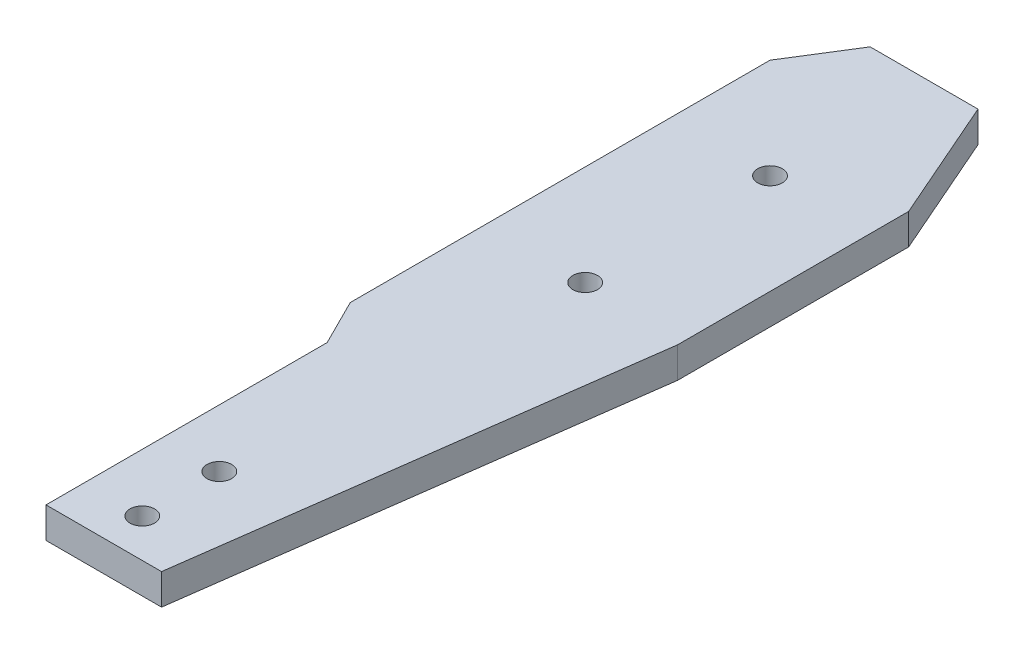
ISO-10303-21;
HEADER;
FILE_DESCRIPTION(('STEP AP214'),'2;1');
FILE_NAME('part.step','',(''),(''),'','','');
FILE_SCHEMA(('AUTOMOTIVE_DESIGN { 1 0 10303 214 1 1 1 1 }'));
ENDSEC;
DATA;
#1=APPLICATION_CONTEXT('core data for automotive mechanical design processes');
#2=APPLICATION_PROTOCOL_DEFINITION('international standard','automotive_design',2000,#1);
#3=PRODUCT_CONTEXT('',#1,'mechanical');
#4=PRODUCT('Part','Part','',(#3));
#5=PRODUCT_RELATED_PRODUCT_CATEGORY('part','',(#4));
#6=PRODUCT_DEFINITION_FORMATION('','',#4);
#7=PRODUCT_DEFINITION_CONTEXT('part definition',#1,'design');
#8=PRODUCT_DEFINITION('design','',#6,#7);
#9=PRODUCT_DEFINITION_SHAPE('','',#8);
#10=(LENGTH_UNIT() NAMED_UNIT(*) SI_UNIT(.MILLI.,.METRE.));
#11=(NAMED_UNIT(*) PLANE_ANGLE_UNIT() SI_UNIT($,.RADIAN.));
#12=(NAMED_UNIT(*) SI_UNIT($,.STERADIAN.) SOLID_ANGLE_UNIT());
#13=UNCERTAINTY_MEASURE_WITH_UNIT(LENGTH_MEASURE(1.E-05),#10,'distance_accuracy_value','');
#14=(GEOMETRIC_REPRESENTATION_CONTEXT(3) GLOBAL_UNCERTAINTY_ASSIGNED_CONTEXT((#13)) GLOBAL_UNIT_ASSIGNED_CONTEXT((#10,
#11,#12)) REPRESENTATION_CONTEXT('',''));
#15=CARTESIAN_POINT('',(0.,0.,0.));
#16=DIRECTION('',(0.,0.,1.));
#17=DIRECTION('',(1.,0.,0.));
#18=AXIS2_PLACEMENT_3D('',#15,#16,#17);
#19=CARTESIAN_POINT('',(0.,4.,0.));
#20=DIRECTION('',(1.,0.,0.));
#21=DIRECTION('',(0.,0.,-1.));
#22=AXIS2_PLACEMENT_3D('',#19,#20,#21);
#23=PLANE('',#22);
#24=DIRECTION('',(0.,0.,1.));
#25=VECTOR('',#24,1.);
#26=CARTESIAN_POINT('',(0.,0.,0.));
#27=LINE('',#26,#25);
#28=CARTESIAN_POINT('',(0.,0.,0.));
#29=VERTEX_POINT('',#28);
#30=CARTESIAN_POINT('',(0.,0.,54.5));
#31=VERTEX_POINT('',#30);
#32=EDGE_CURVE('E140',#29,#31,#27,.T.);
#33=ORIENTED_EDGE('',*,*,#32,.T.);
#34=DIRECTION('',(0.,-1.,0.));
#35=VECTOR('',#34,1.);
#36=CARTESIAN_POINT('',(0.,4.,54.5));
#37=LINE('',#36,#35);
#38=CARTESIAN_POINT('',(0.,4.,54.5));
#39=VERTEX_POINT('',#38);
#40=EDGE_CURVE('E11',#39,#31,#37,.T.);
#41=ORIENTED_EDGE('',*,*,#40,.F.);
#42=DIRECTION('',(0.,0.,1.));
#43=VECTOR('',#42,1.);
#44=CARTESIAN_POINT('',(0.,4.,0.));
#45=LINE('',#44,#43);
#46=CARTESIAN_POINT('',(0.,4.,0.));
#47=VERTEX_POINT('',#46);
#48=EDGE_CURVE('E157',#47,#39,#45,.T.);
#49=ORIENTED_EDGE('',*,*,#48,.F.);
#50=DIRECTION('',(0.,-1.,0.));
#51=VECTOR('',#50,1.);
#52=CARTESIAN_POINT('',(0.,4.,0.));
#53=LINE('',#52,#51);
#54=EDGE_CURVE('E136',#47,#29,#53,.T.);
#55=ORIENTED_EDGE('',*,*,#54,.T.);
#56=EDGE_LOOP('',(#33,#41,#49,#55));
#57=FACE_BOUND('',#56,.T.);
#58=ADVANCED_FACE('F38',(#57),#23,.F.);
#59=CARTESIAN_POINT('',(-21.8,4.,10.9));
#60=DIRECTION('',(0.894427190999916,0.,-0.447213595499958));
#61=DIRECTION('',(-0.447213595499958,0.,-0.894427190999916));
#62=AXIS2_PLACEMENT_3D('',#59,#60,#61);
#63=PLANE('',#62);
#64=DIRECTION('',(0.447213595499958,0.,0.894427190999916));
#65=VECTOR('',#64,1.);
#66=CARTESIAN_POINT('',(-21.8,0.,10.9));
#67=LINE('',#66,#65);
#68=CARTESIAN_POINT('',(3.00000000000001,0.,60.5));
#69=VERTEX_POINT('',#68);
#70=EDGE_CURVE('E143',#31,#69,#67,.T.);
#71=ORIENTED_EDGE('',*,*,#70,.T.);
#72=DIRECTION('',(0.,-1.,0.));
#73=VECTOR('',#72,1.);
#74=CARTESIAN_POINT('',(3.00000000000001,4.,60.5));
#75=LINE('',#74,#73);
#76=CARTESIAN_POINT('',(3.00000000000001,4.,60.5));
#77=VERTEX_POINT('',#76);
#78=EDGE_CURVE('E46',#77,#69,#75,.T.);
#79=ORIENTED_EDGE('',*,*,#78,.F.);
#80=DIRECTION('',(0.447213595499958,0.,0.894427190999916));
#81=VECTOR('',#80,1.);
#82=CARTESIAN_POINT('',(-21.8,4.,10.9));
#83=LINE('',#82,#81);
#84=EDGE_CURVE('E100',#39,#77,#83,.T.);
#85=ORIENTED_EDGE('',*,*,#84,.F.);
#86=ORIENTED_EDGE('',*,*,#40,.T.);
#87=EDGE_LOOP('',(#71,#79,#85,#86));
#88=FACE_BOUND('',#87,.T.);
#89=ADVANCED_FACE('F255',(#88),#63,.F.);
#90=CARTESIAN_POINT('',(3.,4.,0.));
#91=DIRECTION('',(1.,0.,0.));
#92=DIRECTION('',(0.,0.,-1.));
#93=AXIS2_PLACEMENT_3D('',#90,#91,#92);
#94=PLANE('',#93);
#95=DIRECTION('',(0.,0.,1.));
#96=VECTOR('',#95,1.);
#97=CARTESIAN_POINT('',(3.,0.,0.));
#98=LINE('',#97,#96);
#99=CARTESIAN_POINT('',(3.00000000000001,0.,97.));
#100=VERTEX_POINT('',#99);
#101=EDGE_CURVE('E146',#69,#100,#98,.T.);
#102=ORIENTED_EDGE('',*,*,#101,.T.);
#103=DIRECTION('',(0.,-1.,0.));
#104=VECTOR('',#103,1.);
#105=CARTESIAN_POINT('',(3.00000000000001,4.,97.));
#106=LINE('',#105,#104);
#107=CARTESIAN_POINT('',(3.00000000000001,4.,97.));
#108=VERTEX_POINT('',#107);
#109=EDGE_CURVE('E167',#108,#100,#106,.T.);
#110=ORIENTED_EDGE('',*,*,#109,.F.);
#111=DIRECTION('',(0.,0.,1.));
#112=VECTOR('',#111,1.);
#113=CARTESIAN_POINT('',(3.,4.,0.));
#114=LINE('',#113,#112);
#115=EDGE_CURVE('E175',#77,#108,#114,.T.);
#116=ORIENTED_EDGE('',*,*,#115,.F.);
#117=ORIENTED_EDGE('',*,*,#78,.T.);
#118=EDGE_LOOP('',(#102,#110,#116,#117));
#119=FACE_BOUND('',#118,.T.);
#120=ADVANCED_FACE('F173',(#119),#94,.F.);
#121=CARTESIAN_POINT('',(0.,4.,97.));
#122=DIRECTION('',(0.,0.,-1.));
#123=DIRECTION('',(-1.,0.,0.));
#124=AXIS2_PLACEMENT_3D('',#121,#122,#123);
#125=PLANE('',#124);
#126=DIRECTION('',(1.,0.,0.));
#127=VECTOR('',#126,1.);
#128=CARTESIAN_POINT('',(0.,0.,97.));
#129=LINE('',#128,#127);
#130=CARTESIAN_POINT('',(18.,0.,97.));
#131=VERTEX_POINT('',#130);
#132=EDGE_CURVE('E148',#100,#131,#129,.T.);
#133=ORIENTED_EDGE('',*,*,#132,.T.);
#134=DIRECTION('',(0.,-1.,0.));
#135=VECTOR('',#134,1.);
#136=CARTESIAN_POINT('',(18.,4.,97.));
#137=LINE('',#136,#135);
#138=CARTESIAN_POINT('',(18.,4.,97.));
#139=VERTEX_POINT('',#138);
#140=EDGE_CURVE('E164',#139,#131,#137,.T.);
#141=ORIENTED_EDGE('',*,*,#140,.F.);
#142=DIRECTION('',(1.,0.,0.));
#143=VECTOR('',#142,1.);
#144=CARTESIAN_POINT('',(0.,4.,97.));
#145=LINE('',#144,#143);
#146=EDGE_CURVE('E191',#108,#139,#145,.T.);
#147=ORIENTED_EDGE('',*,*,#146,.F.);
#148=ORIENTED_EDGE('',*,*,#109,.T.);
#149=EDGE_LOOP('',(#133,#141,#147,#148));
#150=FACE_BOUND('',#149,.T.);
#151=ADVANCED_FACE('F184',(#150),#125,.F.);
#152=CARTESIAN_POINT('',(30.5901269393512,4.,4.1478138222849));
#153=DIRECTION('',(-0.990932088180138,0.,-0.134363672973578));
#154=DIRECTION('',(-0.134363672973578,0.,0.990932088180138));
#155=AXIS2_PLACEMENT_3D('',#152,#153,#154);
#156=PLANE('',#155);
#157=DIRECTION('',(0.134363672973578,0.,-0.990932088180138));
#158=VECTOR('',#157,1.);
#159=CARTESIAN_POINT('',(30.5901269393512,0.,4.1478138222849));
#160=LINE('',#159,#158);
#161=CARTESIAN_POINT('',(26.,0.,38.));
#162=VERTEX_POINT('',#161);
#163=EDGE_CURVE('E150',#131,#162,#160,.T.);
#164=ORIENTED_EDGE('',*,*,#163,.T.);
#165=DIRECTION('',(0.,-1.,0.));
#166=VECTOR('',#165,1.);
#167=CARTESIAN_POINT('',(26.,4.,38.));
#168=LINE('',#167,#166);
#169=CARTESIAN_POINT('',(26.,4.,38.));
#170=VERTEX_POINT('',#169);
#171=EDGE_CURVE('E161',#170,#162,#168,.T.);
#172=ORIENTED_EDGE('',*,*,#171,.F.);
#173=DIRECTION('',(0.134363672973578,0.,-0.990932088180138));
#174=VECTOR('',#173,1.);
#175=CARTESIAN_POINT('',(30.5901269393512,4.,4.1478138222849));
#176=LINE('',#175,#174);
#177=EDGE_CURVE('E190',#139,#170,#176,.T.);
#178=ORIENTED_EDGE('',*,*,#177,.F.);
#179=ORIENTED_EDGE('',*,*,#140,.T.);
#180=EDGE_LOOP('',(#164,#172,#178,#179));
#181=FACE_BOUND('',#180,.T.);
#182=ADVANCED_FACE('F188',(#181),#156,.F.);
#183=CARTESIAN_POINT('',(26.,4.,0.));
#184=DIRECTION('',(-1.,0.,0.));
#185=DIRECTION('',(0.,0.,1.));
#186=AXIS2_PLACEMENT_3D('',#183,#184,#185);
#187=PLANE('',#186);
#188=DIRECTION('',(0.,0.,-1.));
#189=VECTOR('',#188,1.);
#190=CARTESIAN_POINT('',(26.,0.,0.));
#191=LINE('',#190,#189);
#192=CARTESIAN_POINT('',(26.,0.,7.99999999999999));
#193=VERTEX_POINT('',#192);
#194=EDGE_CURVE('E152',#162,#193,#191,.T.);
#195=ORIENTED_EDGE('',*,*,#194,.T.);
#196=DIRECTION('',(0.,-1.,0.));
#197=VECTOR('',#196,1.);
#198=CARTESIAN_POINT('',(26.,4.,7.99999999999999));
#199=LINE('',#198,#197);
#200=CARTESIAN_POINT('',(26.,4.,7.99999999999999));
#201=VERTEX_POINT('',#200);
#202=EDGE_CURVE('E131',#201,#193,#199,.T.);
#203=ORIENTED_EDGE('',*,*,#202,.F.);
#204=DIRECTION('',(0.,0.,-1.));
#205=VECTOR('',#204,1.);
#206=CARTESIAN_POINT('',(26.,4.,0.));
#207=LINE('',#206,#205);
#208=EDGE_CURVE('E122',#170,#201,#207,.T.);
#209=ORIENTED_EDGE('',*,*,#208,.F.);
#210=ORIENTED_EDGE('',*,*,#171,.T.);
#211=EDGE_LOOP('',(#195,#203,#209,#210));
#212=FACE_BOUND('',#211,.T.);
#213=ADVANCED_FACE('F263',(#212),#187,.F.);
#214=CARTESIAN_POINT('',(18.8852459016394,4.,-8.2622950819672));
#215=DIRECTION('',(-0.916157334902189,0.,0.400818834019707));
#216=DIRECTION('',(0.400818834019707,0.,0.91615733490219));
#217=AXIS2_PLACEMENT_3D('',#214,#215,#216);
#218=PLANE('',#217);
#219=DIRECTION('',(-0.400818834019707,0.,-0.91615733490219));
#220=VECTOR('',#219,1.);
#221=CARTESIAN_POINT('',(18.8852459016394,0.,-8.2622950819672));
#222=LINE('',#221,#220);
#223=CARTESIAN_POINT('',(19.,0.,-8.));
#224=VERTEX_POINT('',#223);
#225=EDGE_CURVE('E130',#193,#224,#222,.T.);
#226=ORIENTED_EDGE('',*,*,#225,.T.);
#227=DIRECTION('',(0.,-1.,0.));
#228=VECTOR('',#227,1.);
#229=CARTESIAN_POINT('',(19.,4.,-8.));
#230=LINE('',#229,#228);
#231=CARTESIAN_POINT('',(19.,4.,-8.));
#232=VERTEX_POINT('',#231);
#233=EDGE_CURVE('E127',#232,#224,#230,.T.);
#234=ORIENTED_EDGE('',*,*,#233,.F.);
#235=DIRECTION('',(-0.400818834019707,0.,-0.91615733490219));
#236=VECTOR('',#235,1.);
#237=CARTESIAN_POINT('',(18.8852459016394,4.,-8.2622950819672));
#238=LINE('',#237,#236);
#239=EDGE_CURVE('E116',#201,#232,#238,.T.);
#240=ORIENTED_EDGE('',*,*,#239,.F.);
#241=ORIENTED_EDGE('',*,*,#202,.T.);
#242=EDGE_LOOP('',(#226,#234,#240,#241));
#243=FACE_BOUND('',#242,.T.);
#244=ADVANCED_FACE('F128',(#243),#218,.F.);
#245=CARTESIAN_POINT('',(0.,4.,-8.));
#246=DIRECTION('',(0.,0.,1.));
#247=DIRECTION('',(1.,0.,0.));
#248=AXIS2_PLACEMENT_3D('',#245,#246,#247);
#249=PLANE('',#248);
#250=DIRECTION('',(-1.,0.,0.));
#251=VECTOR('',#250,1.);
#252=CARTESIAN_POINT('',(0.,0.,-8.));
#253=LINE('',#252,#251);
#254=CARTESIAN_POINT('',(5.,0.,-8.));
#255=VERTEX_POINT('',#254);
#256=EDGE_CURVE('E86',#224,#255,#253,.T.);
#257=ORIENTED_EDGE('',*,*,#256,.T.);
#258=DIRECTION('',(0.,-1.,0.));
#259=VECTOR('',#258,1.);
#260=CARTESIAN_POINT('',(5.,4.,-8.));
#261=LINE('',#260,#259);
#262=CARTESIAN_POINT('',(5.,4.,-8.));
#263=VERTEX_POINT('',#262);
#264=EDGE_CURVE('E132',#263,#255,#261,.T.);
#265=ORIENTED_EDGE('',*,*,#264,.F.);
#266=DIRECTION('',(-1.,0.,0.));
#267=VECTOR('',#266,1.);
#268=CARTESIAN_POINT('',(0.,4.,-8.));
#269=LINE('',#268,#267);
#270=EDGE_CURVE('E120',#232,#263,#269,.T.);
#271=ORIENTED_EDGE('',*,*,#270,.F.);
#272=ORIENTED_EDGE('',*,*,#233,.T.);
#273=EDGE_LOOP('',(#257,#265,#271,#272));
#274=FACE_BOUND('',#273,.T.);
#275=ADVANCED_FACE('F134',(#274),#249,.F.);
#276=CARTESIAN_POINT('',(0.,4.,0.));
#277=DIRECTION('',(0.847998304005088,0.,0.52999894000318));
#278=DIRECTION('',(0.52999894000318,0.,-0.847998304005088));
#279=AXIS2_PLACEMENT_3D('',#276,#277,#278);
#280=PLANE('',#279);
#281=DIRECTION('',(-0.52999894000318,0.,0.847998304005088));
#282=VECTOR('',#281,1.);
#283=CARTESIAN_POINT('',(0.,0.,0.));
#284=LINE('',#283,#282);
#285=EDGE_CURVE('E92',#255,#29,#284,.T.);
#286=ORIENTED_EDGE('',*,*,#285,.T.);
#287=ORIENTED_EDGE('',*,*,#54,.F.);
#288=DIRECTION('',(-0.52999894000318,0.,0.847998304005088));
#289=VECTOR('',#288,1.);
#290=CARTESIAN_POINT('',(0.,4.,0.));
#291=LINE('',#290,#289);
#292=EDGE_CURVE('E54',#263,#47,#291,.T.);
#293=ORIENTED_EDGE('',*,*,#292,.F.);
#294=ORIENTED_EDGE('',*,*,#264,.T.);
#295=EDGE_LOOP('',(#286,#287,#293,#294));
#296=FACE_BOUND('',#295,.T.);
#297=ADVANCED_FACE('F233',(#296),#280,.F.);
#298=CARTESIAN_POINT('',(0.,4.,0.));
#299=DIRECTION('',(0.,1.,0.));
#300=DIRECTION('',(0.,0.,1.));
#301=AXIS2_PLACEMENT_3D('',#298,#299,#300);
#302=PLANE('',#301);
#303=CARTESIAN_POINT('',(13.,4.,13.));
#304=DIRECTION('',(0.,1.,0.));
#305=DIRECTION('',(0.,0.,1.));
#306=AXIS2_PLACEMENT_3D('',#303,#304,#305);
#307=CIRCLE('',#306,1.6);
#308=CARTESIAN_POINT('',(13.,4.,14.6));
#309=VERTEX_POINT('',#308);
#310=EDGE_CURVE('E216',#309,#309,#307,.T.);
#311=ORIENTED_EDGE('',*,*,#310,.F.);
#312=EDGE_LOOP('',(#311));
#313=FACE_BOUND('',#312,.T.);
#314=CARTESIAN_POINT('',(13.,4.,37.));
#315=DIRECTION('',(0.,1.,0.));
#316=DIRECTION('',(0.,0.,1.));
#317=AXIS2_PLACEMENT_3D('',#314,#315,#316);
#318=CIRCLE('',#317,1.6);
#319=CARTESIAN_POINT('',(13.,4.,38.6));
#320=VERTEX_POINT('',#319);
#321=EDGE_CURVE('E210',#320,#320,#318,.T.);
#322=ORIENTED_EDGE('',*,*,#321,.F.);
#323=EDGE_LOOP('',(#322));
#324=FACE_BOUND('',#323,.T.);
#325=CARTESIAN_POINT('',(10.5,4.,82.));
#326=DIRECTION('',(0.,1.,0.));
#327=DIRECTION('',(0.,0.,1.));
#328=AXIS2_PLACEMENT_3D('',#325,#326,#327);
#329=CIRCLE('',#328,1.6);
#330=CARTESIAN_POINT('',(10.5,4.,83.6));
#331=VERTEX_POINT('',#330);
#332=EDGE_CURVE('E204',#331,#331,#329,.T.);
#333=ORIENTED_EDGE('',*,*,#332,.F.);
#334=EDGE_LOOP('',(#333));
#335=FACE_BOUND('',#334,.T.);
#336=CARTESIAN_POINT('',(10.5,4.,92.));
#337=DIRECTION('',(0.,1.,0.));
#338=DIRECTION('',(0.,0.,1.));
#339=AXIS2_PLACEMENT_3D('',#336,#337,#338);
#340=CIRCLE('',#339,1.6);
#341=CARTESIAN_POINT('',(10.5,4.,93.6));
#342=VERTEX_POINT('',#341);
#343=EDGE_CURVE('E198',#342,#342,#340,.T.);
#344=ORIENTED_EDGE('',*,*,#343,.F.);
#345=EDGE_LOOP('',(#344));
#346=FACE_BOUND('',#345,.T.);
#347=ORIENTED_EDGE('',*,*,#48,.T.);
#348=ORIENTED_EDGE('',*,*,#84,.T.);
#349=ORIENTED_EDGE('',*,*,#115,.T.);
#350=ORIENTED_EDGE('',*,*,#146,.T.);
#351=ORIENTED_EDGE('',*,*,#177,.T.);
#352=ORIENTED_EDGE('',*,*,#208,.T.);
#353=ORIENTED_EDGE('',*,*,#239,.T.);
#354=ORIENTED_EDGE('',*,*,#270,.T.);
#355=ORIENTED_EDGE('',*,*,#292,.T.);
#356=EDGE_LOOP('',(#347,#348,#349,#350,#351,#352,#353,#354,#355));
#357=FACE_BOUND('',#356,.T.);
#358=ADVANCED_FACE('F118',(#313,#324,#335,#346,#357),#302,.T.);
#359=CARTESIAN_POINT('',(0.,0.,0.));
#360=DIRECTION('',(0.,1.,0.));
#361=DIRECTION('',(0.,0.,1.));
#362=AXIS2_PLACEMENT_3D('',#359,#360,#361);
#363=PLANE('',#362);
#364=CARTESIAN_POINT('',(13.,0.,13.));
#365=DIRECTION('',(0.,1.,0.));
#366=DIRECTION('',(0.,0.,1.));
#367=AXIS2_PLACEMENT_3D('',#364,#365,#366);
#368=CIRCLE('',#367,1.6);
#369=CARTESIAN_POINT('',(13.,0.,14.6));
#370=VERTEX_POINT('',#369);
#371=EDGE_CURVE('E144',#370,#370,#368,.T.);
#372=ORIENTED_EDGE('',*,*,#371,.T.);
#373=EDGE_LOOP('',(#372));
#374=FACE_BOUND('',#373,.T.);
#375=CARTESIAN_POINT('',(13.,0.,37.));
#376=DIRECTION('',(0.,1.,0.));
#377=DIRECTION('',(0.,0.,1.));
#378=AXIS2_PLACEMENT_3D('',#375,#376,#377);
#379=CIRCLE('',#378,1.6);
#380=CARTESIAN_POINT('',(13.,0.,38.6));
#381=VERTEX_POINT('',#380);
#382=EDGE_CURVE('E213',#381,#381,#379,.T.);
#383=ORIENTED_EDGE('',*,*,#382,.T.);
#384=EDGE_LOOP('',(#383));
#385=FACE_BOUND('',#384,.T.);
#386=CARTESIAN_POINT('',(10.5,0.,82.));
#387=DIRECTION('',(0.,1.,0.));
#388=DIRECTION('',(0.,0.,1.));
#389=AXIS2_PLACEMENT_3D('',#386,#387,#388);
#390=CIRCLE('',#389,1.6);
#391=CARTESIAN_POINT('',(10.5,0.,83.6));
#392=VERTEX_POINT('',#391);
#393=EDGE_CURVE('E207',#392,#392,#390,.T.);
#394=ORIENTED_EDGE('',*,*,#393,.T.);
#395=EDGE_LOOP('',(#394));
#396=FACE_BOUND('',#395,.T.);
#397=CARTESIAN_POINT('',(10.5,0.,92.));
#398=DIRECTION('',(0.,1.,0.));
#399=DIRECTION('',(0.,0.,1.));
#400=AXIS2_PLACEMENT_3D('',#397,#398,#399);
#401=CIRCLE('',#400,1.6);
#402=CARTESIAN_POINT('',(10.5,0.,93.6));
#403=VERTEX_POINT('',#402);
#404=EDGE_CURVE('E201',#403,#403,#401,.T.);
#405=ORIENTED_EDGE('',*,*,#404,.T.);
#406=EDGE_LOOP('',(#405));
#407=FACE_BOUND('',#406,.T.);
#408=ORIENTED_EDGE('',*,*,#32,.F.);
#409=ORIENTED_EDGE('',*,*,#285,.F.);
#410=ORIENTED_EDGE('',*,*,#256,.F.);
#411=ORIENTED_EDGE('',*,*,#225,.F.);
#412=ORIENTED_EDGE('',*,*,#194,.F.);
#413=ORIENTED_EDGE('',*,*,#163,.F.);
#414=ORIENTED_EDGE('',*,*,#132,.F.);
#415=ORIENTED_EDGE('',*,*,#101,.F.);
#416=ORIENTED_EDGE('',*,*,#70,.F.);
#417=EDGE_LOOP('',(#408,#409,#410,#411,#412,#413,#414,#415,#416));
#418=FACE_BOUND('',#417,.T.);
#419=ADVANCED_FACE('F179',(#374,#385,#396,#407,#418),#363,.F.);
#420=CARTESIAN_POINT('',(10.5,0.,92.));
#421=DIRECTION('',(0.,1.,0.));
#422=DIRECTION('',(0.,0.,1.));
#423=AXIS2_PLACEMENT_3D('',#420,#421,#422);
#424=CYLINDRICAL_SURFACE('',#423,1.6);
#425=ORIENTED_EDGE('',*,*,#404,.F.);
#426=EDGE_LOOP('',(#425));
#427=FACE_BOUND('',#426,.T.);
#428=ORIENTED_EDGE('',*,*,#343,.T.);
#429=EDGE_LOOP('',(#428));
#430=FACE_BOUND('',#429,.T.);
#431=ADVANCED_FACE('F241',(#427,#430),#424,.F.);
#432=CARTESIAN_POINT('',(10.5,0.,82.));
#433=DIRECTION('',(0.,1.,0.));
#434=DIRECTION('',(0.,0.,1.));
#435=AXIS2_PLACEMENT_3D('',#432,#433,#434);
#436=CYLINDRICAL_SURFACE('',#435,1.6);
#437=ORIENTED_EDGE('',*,*,#393,.F.);
#438=EDGE_LOOP('',(#437));
#439=FACE_BOUND('',#438,.T.);
#440=ORIENTED_EDGE('',*,*,#332,.T.);
#441=EDGE_LOOP('',(#440));
#442=FACE_BOUND('',#441,.T.);
#443=ADVANCED_FACE('F243',(#439,#442),#436,.F.);
#444=CARTESIAN_POINT('',(13.,0.,37.));
#445=DIRECTION('',(0.,1.,0.));
#446=DIRECTION('',(0.,0.,1.));
#447=AXIS2_PLACEMENT_3D('',#444,#445,#446);
#448=CYLINDRICAL_SURFACE('',#447,1.6);
#449=ORIENTED_EDGE('',*,*,#382,.F.);
#450=EDGE_LOOP('',(#449));
#451=FACE_BOUND('',#450,.T.);
#452=ORIENTED_EDGE('',*,*,#321,.T.);
#453=EDGE_LOOP('',(#452));
#454=FACE_BOUND('',#453,.T.);
#455=ADVANCED_FACE('F227',(#451,#454),#448,.F.);
#456=CARTESIAN_POINT('',(13.,0.,13.));
#457=DIRECTION('',(0.,1.,0.));
#458=DIRECTION('',(0.,0.,1.));
#459=AXIS2_PLACEMENT_3D('',#456,#457,#458);
#460=CYLINDRICAL_SURFACE('',#459,1.6);
#461=ORIENTED_EDGE('',*,*,#371,.F.);
#462=EDGE_LOOP('',(#461));
#463=FACE_BOUND('',#462,.T.);
#464=ORIENTED_EDGE('',*,*,#310,.T.);
#465=EDGE_LOOP('',(#464));
#466=FACE_BOUND('',#465,.T.);
#467=ADVANCED_FACE('F224',(#463,#466),#460,.F.);
#468=CLOSED_SHELL('',(#58,#89,#120,#151,#182,#213,#244,#275,#297,#358,#419,#431,#443,#455,#467));
#469=MANIFOLD_SOLID_BREP('B2',#468);
#470=ADVANCED_BREP_SHAPE_REPRESENTATION('',(#18,#469),#14);
#471=SHAPE_DEFINITION_REPRESENTATION(#9,#470);
ENDSEC;
END-ISO-10303-21;
